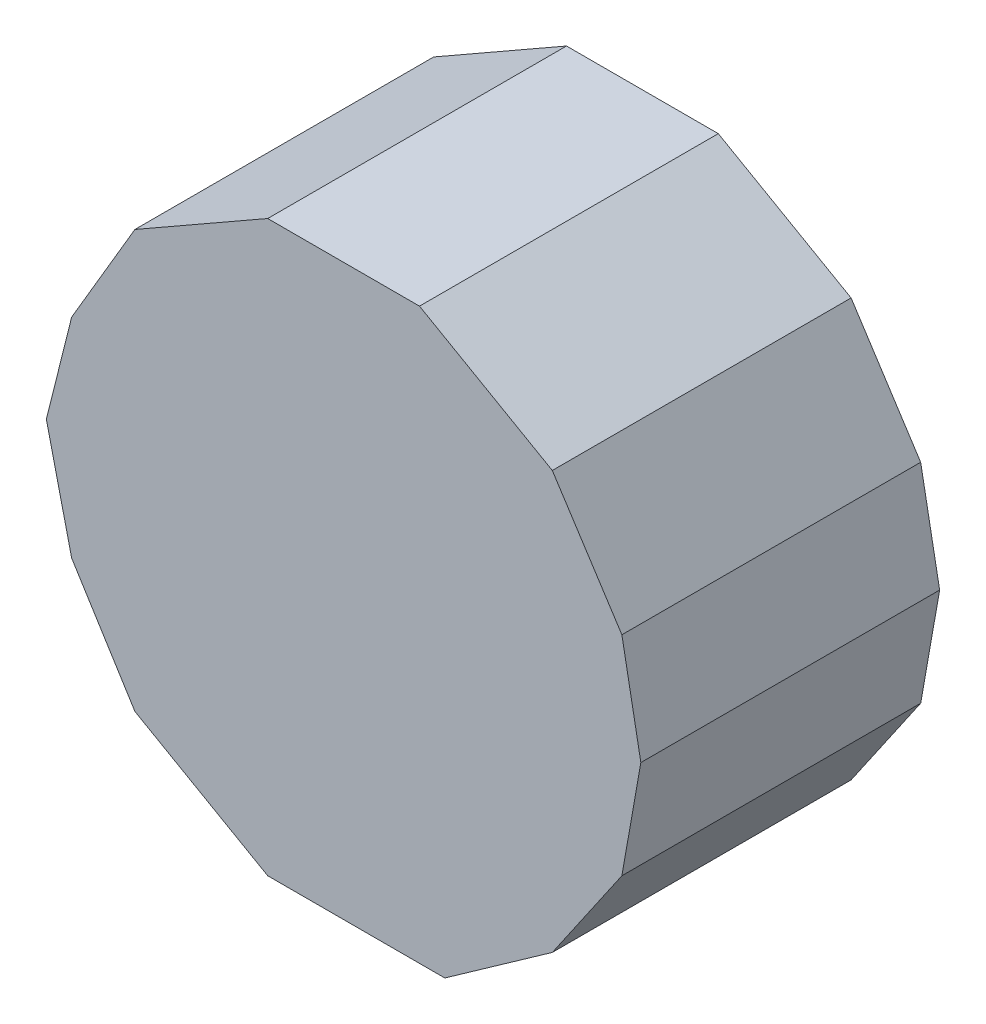
ISO-10303-21;
HEADER;
FILE_DESCRIPTION(('STEP AP214'),'2;1');
FILE_NAME('part.step','',(''),(''),'','','');
FILE_SCHEMA(('AUTOMOTIVE_DESIGN { 1 0 10303 214 1 1 1 1 }'));
ENDSEC;
DATA;
#1=APPLICATION_CONTEXT('core data for automotive mechanical design processes');
#2=APPLICATION_PROTOCOL_DEFINITION('international standard','automotive_design',2000,#1);
#3=PRODUCT_CONTEXT('',#1,'mechanical');
#4=PRODUCT('Part','Part','',(#3));
#5=PRODUCT_RELATED_PRODUCT_CATEGORY('part','',(#4));
#6=PRODUCT_DEFINITION_FORMATION('','',#4);
#7=PRODUCT_DEFINITION_CONTEXT('part definition',#1,'design');
#8=PRODUCT_DEFINITION('design','',#6,#7);
#9=PRODUCT_DEFINITION_SHAPE('','',#8);
#10=(LENGTH_UNIT() NAMED_UNIT(*) SI_UNIT(.MILLI.,.METRE.));
#11=(NAMED_UNIT(*) PLANE_ANGLE_UNIT() SI_UNIT($,.RADIAN.));
#12=(NAMED_UNIT(*) SI_UNIT($,.STERADIAN.) SOLID_ANGLE_UNIT());
#13=UNCERTAINTY_MEASURE_WITH_UNIT(LENGTH_MEASURE(1.E-05),#10,'distance_accuracy_value','');
#14=(GEOMETRIC_REPRESENTATION_CONTEXT(3) GLOBAL_UNCERTAINTY_ASSIGNED_CONTEXT((#13)) GLOBAL_UNIT_ASSIGNED_CONTEXT((#10,
#11,#12)) REPRESENTATION_CONTEXT('',''));
#15=CARTESIAN_POINT('',(0.,0.,0.));
#16=DIRECTION('',(0.,0.,1.));
#17=DIRECTION('',(1.,0.,0.));
#18=AXIS2_PLACEMENT_3D('',#15,#16,#17);
#19=CARTESIAN_POINT('',(-4.191,-4.19097714,6.0000007));
#20=DIRECTION('',(0.,0.,-1.));
#21=DIRECTION('',(-1.,0.,0.));
#22=AXIS2_PLACEMENT_3D('',#19,#20,#21);
#23=PLANE('',#22);
#24=DIRECTION('',(1.,0.,0.));
#25=VECTOR('',#24,1.);
#26=CARTESIAN_POINT('',(-1.524,-5.715,6.0000007));
#27=LINE('',#26,#25);
#28=CARTESIAN_POINT('',(-1.52399999999999,-5.71499999999999,6.0000007));
#29=VERTEX_POINT('',#28);
#30=CARTESIAN_POINT('',(2.032,-5.715,6.0000007));
#31=VERTEX_POINT('',#30);
#32=EDGE_CURVE('E175',#29,#31,#27,.T.);
#33=ORIENTED_EDGE('',*,*,#32,.T.);
#34=DIRECTION('',(-0.816966664628641,-0.576684895662747,0.));
#35=VECTOR('',#34,1.);
#36=CARTESIAN_POINT('',(2.032,-5.715,6.0000007));
#37=LINE('',#36,#35);
#38=CARTESIAN_POINT('',(4.19102285999992,-4.19097713999988,6.0000007));
#39=VERTEX_POINT('',#38);
#40=EDGE_CURVE('E171',#31,#39,#37,.F.);
#41=ORIENTED_EDGE('',*,*,#40,.T.);
#42=DIRECTION('',(-0.566526855650862,-0.824043276670799,0.));
#43=VECTOR('',#42,1.);
#44=CARTESIAN_POINT('',(4.19102286,-4.19097714,6.0000007));
#45=LINE('',#44,#43);
#46=CARTESIAN_POINT('',(5.58799999999976,-2.15899999999983,6.0000007));
#47=VERTEX_POINT('',#46);
#48=EDGE_CURVE('E167',#39,#47,#45,.F.);
#49=ORIENTED_EDGE('',*,*,#48,.T.);
#50=DIRECTION('',(-0.173785333908991,-0.984783558817947,0.));
#51=VECTOR('',#50,1.);
#52=CARTESIAN_POINT('',(5.588,-2.159,6.0000007));
#53=LINE('',#52,#51);
#54=CARTESIAN_POINT('',(5.96899999999997,0.,6.0000007));
#55=VERTEX_POINT('',#54);
#56=EDGE_CURVE('E163',#47,#55,#53,.F.);
#57=ORIENTED_EDGE('',*,*,#56,.T.);
#58=DIRECTION('',(0.184288535050065,-0.982872186934345,0.));
#59=VECTOR('',#58,1.);
#60=CARTESIAN_POINT('',(5.969,0.,6.0000007));
#61=LINE('',#60,#59);
#62=CARTESIAN_POINT('',(5.58800000000006,2.03200000000001,6.0000007));
#63=VERTEX_POINT('',#62);
#64=EDGE_CURVE('E159',#55,#63,#61,.F.);
#65=ORIENTED_EDGE('',*,*,#64,.T.);
#66=DIRECTION('',(0.54325127815715,-0.839570157152232,0.));
#67=VECTOR('',#66,1.);
#68=CARTESIAN_POINT('',(5.588,2.032,6.0000007));
#69=LINE('',#68,#67);
#70=CARTESIAN_POINT('',(4.19100000000008,4.19100000000005,6.0000007));
#71=VERTEX_POINT('',#70);
#72=EDGE_CURVE('E155',#63,#71,#69,.F.);
#73=ORIENTED_EDGE('',*,*,#72,.T.);
#74=DIRECTION('',(0.868243142124275,-0.496138938357157,0.));
#75=VECTOR('',#74,1.);
#76=CARTESIAN_POINT('',(4.191,4.191,6.0000007));
#77=LINE('',#76,#75);
#78=CARTESIAN_POINT('',(1.52400000000014,5.71500000000025,6.0000007));
#79=VERTEX_POINT('',#78);
#80=EDGE_CURVE('E151',#71,#79,#77,.F.);
#81=ORIENTED_EDGE('',*,*,#80,.T.);
#82=DIRECTION('',(1.,0.,0.));
#83=VECTOR('',#82,1.);
#84=CARTESIAN_POINT('',(1.524,5.715,6.0000007));
#85=LINE('',#84,#83);
#86=CARTESIAN_POINT('',(-1.524,5.715,6.0000007));
#87=VERTEX_POINT('',#86);
#88=EDGE_CURVE('E147',#79,#87,#85,.F.);
#89=ORIENTED_EDGE('',*,*,#88,.T.);
#90=DIRECTION('',(0.868243142124275,0.496138938357157,0.));
#91=VECTOR('',#90,1.);
#92=CARTESIAN_POINT('',(-1.524,5.715,6.0000007));
#93=LINE('',#92,#91);
#94=CARTESIAN_POINT('',(-4.19099999999986,4.19099999999975,6.0000007));
#95=VERTEX_POINT('',#94);
#96=EDGE_CURVE('E143',#87,#95,#93,.F.);
#97=ORIENTED_EDGE('',*,*,#96,.T.);
#98=DIRECTION('',(0.507020126563001,0.861934215158001,0.));
#99=VECTOR('',#98,1.);
#100=CARTESIAN_POINT('',(-4.191,4.191,6.0000007));
#101=LINE('',#100,#99);
#102=CARTESIAN_POINT('',(-5.46099999999975,2.03199999999986,6.0000007));
#103=VERTEX_POINT('',#102);
#104=EDGE_CURVE('E139',#95,#103,#101,.F.);
#105=ORIENTED_EDGE('',*,*,#104,.T.);
#106=DIRECTION('',(0.242535625036098,0.970142500145391,0.));
#107=VECTOR('',#106,1.);
#108=CARTESIAN_POINT('',(-5.461,2.032,6.0000007));
#109=LINE('',#108,#107);
#110=CARTESIAN_POINT('',(-5.96899999999988,0.,6.0000007));
#111=VERTEX_POINT('',#110);
#112=EDGE_CURVE('E115',#103,#111,#109,.F.);
#113=ORIENTED_EDGE('',*,*,#112,.T.);
#114=DIRECTION('',(-0.229039333726105,0.973417168333445,0.));
#115=VECTOR('',#114,1.);
#116=CARTESIAN_POINT('',(-5.969,0.,6.0000007));
#117=LINE('',#116,#115);
#118=CARTESIAN_POINT('',(-5.46099999999969,-2.15899999999993,6.0000007));
#119=VERTEX_POINT('',#118);
#120=EDGE_CURVE('E117',#111,#119,#117,.F.);
#121=ORIENTED_EDGE('',*,*,#120,.T.);
#122=DIRECTION('',(-0.530003227662832,0.847995624202732,0.));
#123=VECTOR('',#122,1.);
#124=CARTESIAN_POINT('',(-5.461,-2.159,6.0000007));
#125=LINE('',#124,#123);
#126=CARTESIAN_POINT('',(-4.19100000000016,-4.1909771400001,6.0000007));
#127=VERTEX_POINT('',#126);
#128=EDGE_CURVE('E19',#119,#127,#125,.F.);
#129=ORIENTED_EDGE('',*,*,#128,.T.);
#130=DIRECTION('',(-0.86823993629735,0.4961445485122,0.));
#131=VECTOR('',#130,1.);
#132=CARTESIAN_POINT('',(-4.191,-4.19097714,6.0000007));
#133=LINE('',#132,#131);
#134=EDGE_CURVE('E180',#127,#29,#133,.F.);
#135=ORIENTED_EDGE('',*,*,#134,.T.);
#136=EDGE_LOOP('',(#33,#41,#49,#57,#65,#73,#81,#89,#97,#105,#113,#121,#129,#135));
#137=FACE_BOUND('',#136,.T.);
#138=ADVANCED_FACE('F16',(#137),#23,.F.);
#139=CARTESIAN_POINT('',(-5.461,-2.159,0.));
#140=DIRECTION('',(0.847995624202732,0.530003227662832,0.));
#141=DIRECTION('',(-0.530003227662832,0.847995624202732,0.));
#142=AXIS2_PLACEMENT_3D('',#139,#140,#141);
#143=PLANE('',#142);
#144=DIRECTION('',(0.,0.,1.));
#145=VECTOR('',#144,1.);
#146=CARTESIAN_POINT('',(-4.191,-4.19097714,0.));
#147=LINE('',#146,#145);
#148=CARTESIAN_POINT('',(-4.19100000000016,-4.1909771400001,0.));
#149=VERTEX_POINT('',#148);
#150=EDGE_CURVE('E128',#149,#127,#147,.T.);
#151=ORIENTED_EDGE('',*,*,#150,.T.);
#152=ORIENTED_EDGE('',*,*,#128,.F.);
#153=DIRECTION('',(0.,0.,1.));
#154=VECTOR('',#153,1.);
#155=CARTESIAN_POINT('',(-5.46099999999876,-2.15899999999971,0.));
#156=LINE('',#155,#154);
#157=CARTESIAN_POINT('',(-5.46099999999969,-2.15899999999993,0.));
#158=VERTEX_POINT('',#157);
#159=EDGE_CURVE('E123',#119,#158,#156,.F.);
#160=ORIENTED_EDGE('',*,*,#159,.T.);
#161=DIRECTION('',(-0.530003227662966,0.847995624202648,0.));
#162=VECTOR('',#161,1.);
#163=CARTESIAN_POINT('',(-4.191,-4.19097714,0.));
#164=LINE('',#163,#162);
#165=EDGE_CURVE('E183',#149,#158,#164,.T.);
#166=ORIENTED_EDGE('',*,*,#165,.F.);
#167=EDGE_LOOP('',(#151,#152,#160,#166));
#168=FACE_BOUND('',#167,.T.);
#169=ADVANCED_FACE('F125',(#168),#143,.F.);
#170=CARTESIAN_POINT('',(-5.969,0.,0.));
#171=DIRECTION('',(0.973417168333445,0.229039333726105,0.));
#172=DIRECTION('',(-0.229039333726105,0.973417168333445,0.));
#173=AXIS2_PLACEMENT_3D('',#170,#171,#172);
#174=PLANE('',#173);
#175=ORIENTED_EDGE('',*,*,#159,.F.);
#176=ORIENTED_EDGE('',*,*,#120,.F.);
#177=DIRECTION('',(0.,0.,1.));
#178=VECTOR('',#177,1.);
#179=CARTESIAN_POINT('',(-5.96899999999951,-1.23165366794353E-13,0.));
#180=LINE('',#179,#178);
#181=CARTESIAN_POINT('',(-5.96899999999988,0.,0.));
#182=VERTEX_POINT('',#181);
#183=EDGE_CURVE('E135',#111,#182,#180,.F.);
#184=ORIENTED_EDGE('',*,*,#183,.T.);
#185=DIRECTION('',(-0.229039333725547,0.973417168333576,0.));
#186=VECTOR('',#185,1.);
#187=CARTESIAN_POINT('',(-5.461,-2.159,0.));
#188=LINE('',#187,#186);
#189=EDGE_CURVE('E132',#158,#182,#188,.T.);
#190=ORIENTED_EDGE('',*,*,#189,.F.);
#191=EDGE_LOOP('',(#175,#176,#184,#190));
#192=FACE_BOUND('',#191,.T.);
#193=ADVANCED_FACE('F130',(#192),#174,.F.);
#194=CARTESIAN_POINT('',(-5.461,2.032,0.));
#195=DIRECTION('',(0.970142500145391,-0.242535625036098,0.));
#196=DIRECTION('',(0.242535625036098,0.970142500145391,0.));
#197=AXIS2_PLACEMENT_3D('',#194,#195,#196);
#198=PLANE('',#197);
#199=ORIENTED_EDGE('',*,*,#183,.F.);
#200=ORIENTED_EDGE('',*,*,#112,.F.);
#201=DIRECTION('',(0.,0.,1.));
#202=VECTOR('',#201,1.);
#203=CARTESIAN_POINT('',(-5.46099999999902,2.03199999999942,0.));
#204=LINE('',#203,#202);
#205=CARTESIAN_POINT('',(-5.46099999999975,2.03199999999986,0.));
#206=VERTEX_POINT('',#205);
#207=EDGE_CURVE('E141',#103,#206,#204,.F.);
#208=ORIENTED_EDGE('',*,*,#207,.T.);
#209=DIRECTION('',(0.242535625036333,0.970142500145332,0.));
#210=VECTOR('',#209,1.);
#211=CARTESIAN_POINT('',(-5.969,0.,0.));
#212=LINE('',#211,#210);
#213=EDGE_CURVE('E186',#182,#206,#212,.T.);
#214=ORIENTED_EDGE('',*,*,#213,.F.);
#215=EDGE_LOOP('',(#199,#200,#208,#214));
#216=FACE_BOUND('',#215,.T.);
#217=ADVANCED_FACE('F267',(#216),#198,.F.);
#218=CARTESIAN_POINT('',(-4.191,4.191,0.));
#219=DIRECTION('',(0.861934215158001,-0.507020126563001,0.));
#220=DIRECTION('',(0.507020126563001,0.861934215158001,0.));
#221=AXIS2_PLACEMENT_3D('',#218,#219,#220);
#222=PLANE('',#221);
#223=ORIENTED_EDGE('',*,*,#207,.F.);
#224=ORIENTED_EDGE('',*,*,#104,.F.);
#225=DIRECTION('',(0.,0.,1.));
#226=VECTOR('',#225,1.);
#227=CARTESIAN_POINT('',(-4.19099999999943,4.19099999999901,0.));
#228=LINE('',#227,#226);
#229=CARTESIAN_POINT('',(-4.19099999999986,4.19099999999975,0.));
#230=VERTEX_POINT('',#229);
#231=EDGE_CURVE('E145',#95,#230,#228,.F.);
#232=ORIENTED_EDGE('',*,*,#231,.T.);
#233=DIRECTION('',(0.507020126563394,0.861934215157769,0.));
#234=VECTOR('',#233,1.);
#235=CARTESIAN_POINT('',(-5.461,2.032,0.));
#236=LINE('',#235,#234);
#237=EDGE_CURVE('E189',#206,#230,#236,.T.);
#238=ORIENTED_EDGE('',*,*,#237,.F.);
#239=EDGE_LOOP('',(#223,#224,#232,#238));
#240=FACE_BOUND('',#239,.T.);
#241=ADVANCED_FACE('F265',(#240),#222,.F.);
#242=CARTESIAN_POINT('',(-1.524,5.715,0.));
#243=DIRECTION('',(0.496138938357157,-0.868243142124275,0.));
#244=DIRECTION('',(0.868243142124275,0.496138938357157,0.));
#245=AXIS2_PLACEMENT_3D('',#242,#243,#244);
#246=PLANE('',#245);
#247=ORIENTED_EDGE('',*,*,#231,.F.);
#248=ORIENTED_EDGE('',*,*,#96,.F.);
#249=DIRECTION('',(0.,0.,-1.));
#250=VECTOR('',#249,1.);
#251=CARTESIAN_POINT('',(-1.524,5.715,0.));
#252=LINE('',#251,#250);
#253=CARTESIAN_POINT('',(-1.524,5.715,0.));
#254=VERTEX_POINT('',#253);
#255=EDGE_CURVE('E149',#87,#254,#252,.T.);
#256=ORIENTED_EDGE('',*,*,#255,.T.);
#257=DIRECTION('',(0.868243142124459,0.496138938356834,0.));
#258=VECTOR('',#257,1.);
#259=CARTESIAN_POINT('',(-4.191,4.191,0.));
#260=LINE('',#259,#258);
#261=EDGE_CURVE('E192',#230,#254,#260,.T.);
#262=ORIENTED_EDGE('',*,*,#261,.F.);
#263=EDGE_LOOP('',(#247,#248,#256,#262));
#264=FACE_BOUND('',#263,.T.);
#265=ADVANCED_FACE('F260',(#264),#246,.F.);
#266=CARTESIAN_POINT('',(1.524,5.715,0.));
#267=DIRECTION('',(0.,-1.,0.));
#268=DIRECTION('',(0.,0.,-1.));
#269=AXIS2_PLACEMENT_3D('',#266,#267,#268);
#270=PLANE('',#269);
#271=ORIENTED_EDGE('',*,*,#255,.F.);
#272=ORIENTED_EDGE('',*,*,#88,.F.);
#273=DIRECTION('',(0.,0.,1.));
#274=VECTOR('',#273,1.);
#275=CARTESIAN_POINT('',(1.52400000000057,5.71500000000099,0.));
#276=LINE('',#275,#274);
#277=CARTESIAN_POINT('',(1.52400000000014,5.71500000000025,0.));
#278=VERTEX_POINT('',#277);
#279=EDGE_CURVE('E153',#79,#278,#276,.F.);
#280=ORIENTED_EDGE('',*,*,#279,.T.);
#281=DIRECTION('',(-1.,0.,0.));
#282=VECTOR('',#281,1.);
#283=CARTESIAN_POINT('',(-4.191,5.715,0.));
#284=LINE('',#283,#282);
#285=EDGE_CURVE('E195',#254,#278,#284,.F.);
#286=ORIENTED_EDGE('',*,*,#285,.F.);
#287=EDGE_LOOP('',(#271,#272,#280,#286));
#288=FACE_BOUND('',#287,.T.);
#289=ADVANCED_FACE('F255',(#288),#270,.F.);
#290=CARTESIAN_POINT('',(4.191,4.191,0.));
#291=DIRECTION('',(-0.496138938357157,-0.868243142124275,0.));
#292=DIRECTION('',(0.868243142124275,-0.496138938357157,0.));
#293=AXIS2_PLACEMENT_3D('',#290,#291,#292);
#294=PLANE('',#293);
#295=ORIENTED_EDGE('',*,*,#279,.F.);
#296=ORIENTED_EDGE('',*,*,#80,.F.);
#297=DIRECTION('',(0.,0.,1.));
#298=VECTOR('',#297,1.);
#299=CARTESIAN_POINT('',(4.19100000000032,4.19100000000021,0.));
#300=LINE('',#299,#298);
#301=CARTESIAN_POINT('',(4.19100000000008,4.19100000000005,0.));
#302=VERTEX_POINT('',#301);
#303=EDGE_CURVE('E157',#71,#302,#300,.F.);
#304=ORIENTED_EDGE('',*,*,#303,.T.);
#305=DIRECTION('',(0.868243142124459,-0.496138938356834,0.));
#306=VECTOR('',#305,1.);
#307=CARTESIAN_POINT('',(1.524,5.715,0.));
#308=LINE('',#307,#306);
#309=EDGE_CURVE('E198',#278,#302,#308,.T.);
#310=ORIENTED_EDGE('',*,*,#309,.F.);
#311=EDGE_LOOP('',(#295,#296,#304,#310));
#312=FACE_BOUND('',#311,.T.);
#313=ADVANCED_FACE('F250',(#312),#294,.F.);
#314=CARTESIAN_POINT('',(5.588,2.032,0.));
#315=DIRECTION('',(-0.839570157152232,-0.54325127815715,0.));
#316=DIRECTION('',(0.54325127815715,-0.839570157152232,0.));
#317=AXIS2_PLACEMENT_3D('',#314,#315,#316);
#318=PLANE('',#317);
#319=ORIENTED_EDGE('',*,*,#303,.F.);
#320=ORIENTED_EDGE('',*,*,#72,.F.);
#321=DIRECTION('',(0.,0.,1.));
#322=VECTOR('',#321,1.);
#323=CARTESIAN_POINT('',(5.58800000000025,2.03200000000005,0.));
#324=LINE('',#323,#322);
#325=CARTESIAN_POINT('',(5.58800000000006,2.03200000000001,0.));
#326=VERTEX_POINT('',#325);
#327=EDGE_CURVE('E161',#63,#326,#324,.F.);
#328=ORIENTED_EDGE('',*,*,#327,.T.);
#329=DIRECTION('',(0.543251278157274,-0.839570157152151,0.));
#330=VECTOR('',#329,1.);
#331=CARTESIAN_POINT('',(4.191,4.191,0.));
#332=LINE('',#331,#330);
#333=EDGE_CURVE('E201',#302,#326,#332,.T.);
#334=ORIENTED_EDGE('',*,*,#333,.F.);
#335=EDGE_LOOP('',(#319,#320,#328,#334));
#336=FACE_BOUND('',#335,.T.);
#337=ADVANCED_FACE('F245',(#336),#318,.F.);
#338=CARTESIAN_POINT('',(5.969,0.,0.));
#339=DIRECTION('',(-0.982872186934345,-0.184288535050065,0.));
#340=DIRECTION('',(0.184288535050065,-0.982872186934345,0.));
#341=AXIS2_PLACEMENT_3D('',#338,#339,#340);
#342=PLANE('',#341);
#343=ORIENTED_EDGE('',*,*,#327,.F.);
#344=ORIENTED_EDGE('',*,*,#64,.F.);
#345=DIRECTION('',(0.,0.,1.));
#346=VECTOR('',#345,1.);
#347=CARTESIAN_POINT('',(5.96899999999988,0.,0.));
#348=LINE('',#347,#346);
#349=CARTESIAN_POINT('',(5.96899999999997,0.,0.));
#350=VERTEX_POINT('',#349);
#351=EDGE_CURVE('E165',#55,#350,#348,.F.);
#352=ORIENTED_EDGE('',*,*,#351,.T.);
#353=DIRECTION('',(0.184288535050186,-0.982872186934322,0.));
#354=VECTOR('',#353,1.);
#355=CARTESIAN_POINT('',(5.588,2.032,0.));
#356=LINE('',#355,#354);
#357=EDGE_CURVE('E204',#326,#350,#356,.T.);
#358=ORIENTED_EDGE('',*,*,#357,.F.);
#359=EDGE_LOOP('',(#343,#344,#352,#358));
#360=FACE_BOUND('',#359,.T.);
#361=ADVANCED_FACE('F240',(#360),#342,.F.);
#362=CARTESIAN_POINT('',(5.588,-2.159,0.));
#363=DIRECTION('',(-0.984783558817947,0.173785333908991,0.));
#364=DIRECTION('',(-0.173785333908991,-0.984783558817947,0.));
#365=AXIS2_PLACEMENT_3D('',#362,#363,#364);
#366=PLANE('',#365);
#367=ORIENTED_EDGE('',*,*,#351,.F.);
#368=ORIENTED_EDGE('',*,*,#56,.F.);
#369=DIRECTION('',(0.,0.,1.));
#370=VECTOR('',#369,1.);
#371=CARTESIAN_POINT('',(5.58799999999904,-2.15899999999934,0.));
#372=LINE('',#371,#370);
#373=CARTESIAN_POINT('',(5.58799999999976,-2.15899999999983,0.));
#374=VERTEX_POINT('',#373);
#375=EDGE_CURVE('E169',#47,#374,#372,.F.);
#376=ORIENTED_EDGE('',*,*,#375,.T.);
#377=DIRECTION('',(-0.173785333909048,-0.984783558817937,0.));
#378=VECTOR('',#377,1.);
#379=CARTESIAN_POINT('',(5.969,0.,0.));
#380=LINE('',#379,#378);
#381=EDGE_CURVE('E207',#350,#374,#380,.T.);
#382=ORIENTED_EDGE('',*,*,#381,.F.);
#383=EDGE_LOOP('',(#367,#368,#376,#382));
#384=FACE_BOUND('',#383,.T.);
#385=ADVANCED_FACE('F235',(#384),#366,.F.);
#386=CARTESIAN_POINT('',(4.19102286,-4.19097714,0.));
#387=DIRECTION('',(-0.824043276670799,0.566526855650862,0.));
#388=DIRECTION('',(-0.566526855650862,-0.824043276670799,0.));
#389=AXIS2_PLACEMENT_3D('',#386,#387,#388);
#390=PLANE('',#389);
#391=ORIENTED_EDGE('',*,*,#375,.F.);
#392=ORIENTED_EDGE('',*,*,#48,.F.);
#393=DIRECTION('',(0.,0.,1.));
#394=VECTOR('',#393,1.);
#395=CARTESIAN_POINT('',(4.19102285999966,-4.19097713999952,0.));
#396=LINE('',#395,#394);
#397=CARTESIAN_POINT('',(4.19102285999992,-4.19097713999988,0.));
#398=VERTEX_POINT('',#397);
#399=EDGE_CURVE('E173',#39,#398,#396,.F.);
#400=ORIENTED_EDGE('',*,*,#399,.T.);
#401=DIRECTION('',(-0.566526855651253,-0.824043276670531,0.));
#402=VECTOR('',#401,1.);
#403=CARTESIAN_POINT('',(5.588,-2.159,0.));
#404=LINE('',#403,#402);
#405=EDGE_CURVE('E210',#374,#398,#404,.T.);
#406=ORIENTED_EDGE('',*,*,#405,.F.);
#407=EDGE_LOOP('',(#391,#392,#400,#406));
#408=FACE_BOUND('',#407,.T.);
#409=ADVANCED_FACE('F230',(#408),#390,.F.);
#410=CARTESIAN_POINT('',(2.032,-5.715,0.));
#411=DIRECTION('',(-0.576684895662747,0.816966664628641,0.));
#412=DIRECTION('',(-0.816966664628641,-0.576684895662747,0.));
#413=AXIS2_PLACEMENT_3D('',#410,#411,#412);
#414=PLANE('',#413);
#415=ORIENTED_EDGE('',*,*,#399,.F.);
#416=ORIENTED_EDGE('',*,*,#40,.F.);
#417=DIRECTION('',(0.,0.,1.));
#418=VECTOR('',#417,1.);
#419=CARTESIAN_POINT('',(2.032,-5.715,0.));
#420=LINE('',#419,#418);
#421=CARTESIAN_POINT('',(2.032,-5.715,0.));
#422=VERTEX_POINT('',#421);
#423=EDGE_CURVE('E177',#31,#422,#420,.F.);
#424=ORIENTED_EDGE('',*,*,#423,.T.);
#425=DIRECTION('',(-0.816966664628769,-0.576684895662566,0.));
#426=VECTOR('',#425,1.);
#427=CARTESIAN_POINT('',(4.19102286,-4.19097714,0.));
#428=LINE('',#427,#426);
#429=EDGE_CURVE('E213',#398,#422,#428,.T.);
#430=ORIENTED_EDGE('',*,*,#429,.F.);
#431=EDGE_LOOP('',(#415,#416,#424,#430));
#432=FACE_BOUND('',#431,.T.);
#433=ADVANCED_FACE('F225',(#432),#414,.F.);
#434=CARTESIAN_POINT('',(-1.524,-5.715,0.));
#435=DIRECTION('',(0.,1.,0.));
#436=DIRECTION('',(0.,0.,1.));
#437=AXIS2_PLACEMENT_3D('',#434,#435,#436);
#438=PLANE('',#437);
#439=ORIENTED_EDGE('',*,*,#423,.F.);
#440=ORIENTED_EDGE('',*,*,#32,.F.);
#441=DIRECTION('',(0.,0.,1.));
#442=VECTOR('',#441,1.);
#443=CARTESIAN_POINT('',(-1.52399999999997,-5.71499999999994,0.));
#444=LINE('',#443,#442);
#445=CARTESIAN_POINT('',(-1.52399999999999,-5.71499999999999,0.));
#446=VERTEX_POINT('',#445);
#447=EDGE_CURVE('E34',#29,#446,#444,.F.);
#448=ORIENTED_EDGE('',*,*,#447,.T.);
#449=DIRECTION('',(-1.,0.,0.));
#450=VECTOR('',#449,1.);
#451=CARTESIAN_POINT('',(-4.191,-5.715,0.));
#452=LINE('',#451,#450);
#453=EDGE_CURVE('E25',#422,#446,#452,.T.);
#454=ORIENTED_EDGE('',*,*,#453,.F.);
#455=EDGE_LOOP('',(#439,#440,#448,#454));
#456=FACE_BOUND('',#455,.T.);
#457=ADVANCED_FACE('F221',(#456),#438,.F.);
#458=CARTESIAN_POINT('',(-4.191,-4.19097714,0.));
#459=DIRECTION('',(0.4961445485122,0.86823993629735,0.));
#460=DIRECTION('',(-0.86823993629735,0.4961445485122,0.));
#461=AXIS2_PLACEMENT_3D('',#458,#459,#460);
#462=PLANE('',#461);
#463=ORIENTED_EDGE('',*,*,#447,.F.);
#464=ORIENTED_EDGE('',*,*,#134,.F.);
#465=ORIENTED_EDGE('',*,*,#150,.F.);
#466=DIRECTION('',(-0.868239936297339,0.496144548512219,0.));
#467=VECTOR('',#466,1.);
#468=CARTESIAN_POINT('',(-1.524,-5.715,0.));
#469=LINE('',#468,#467);
#470=EDGE_CURVE('E11',#446,#149,#469,.T.);
#471=ORIENTED_EDGE('',*,*,#470,.F.);
#472=EDGE_LOOP('',(#463,#464,#465,#471));
#473=FACE_BOUND('',#472,.T.);
#474=ADVANCED_FACE('F270',(#473),#462,.F.);
#475=CARTESIAN_POINT('',(-4.191,-4.19097714,0.));
#476=DIRECTION('',(0.,0.,-1.));
#477=DIRECTION('',(-1.,0.,0.));
#478=AXIS2_PLACEMENT_3D('',#475,#476,#477);
#479=PLANE('',#478);
#480=ORIENTED_EDGE('',*,*,#453,.T.);
#481=ORIENTED_EDGE('',*,*,#470,.T.);
#482=ORIENTED_EDGE('',*,*,#165,.T.);
#483=ORIENTED_EDGE('',*,*,#189,.T.);
#484=ORIENTED_EDGE('',*,*,#213,.T.);
#485=ORIENTED_EDGE('',*,*,#237,.T.);
#486=ORIENTED_EDGE('',*,*,#261,.T.);
#487=ORIENTED_EDGE('',*,*,#285,.T.);
#488=ORIENTED_EDGE('',*,*,#309,.T.);
#489=ORIENTED_EDGE('',*,*,#333,.T.);
#490=ORIENTED_EDGE('',*,*,#357,.T.);
#491=ORIENTED_EDGE('',*,*,#381,.T.);
#492=ORIENTED_EDGE('',*,*,#405,.T.);
#493=ORIENTED_EDGE('',*,*,#429,.T.);
#494=EDGE_LOOP('',(#480,#481,#482,#483,#484,#485,#486,#487,#488,#489,#490,#491,#492,#493));
#495=FACE_BOUND('',#494,.T.);
#496=ADVANCED_FACE('F218',(#495),#479,.T.);
#497=CLOSED_SHELL('',(#138,#169,#193,#217,#241,#265,#289,#313,#337,#361,#385,#409,#433,#457,
#474,#496));
#498=MANIFOLD_SOLID_BREP('B1',#497);
#499=ADVANCED_BREP_SHAPE_REPRESENTATION('',(#18,#498),#14);
#500=SHAPE_DEFINITION_REPRESENTATION(#9,#499);
ENDSEC;
END-ISO-10303-21;
